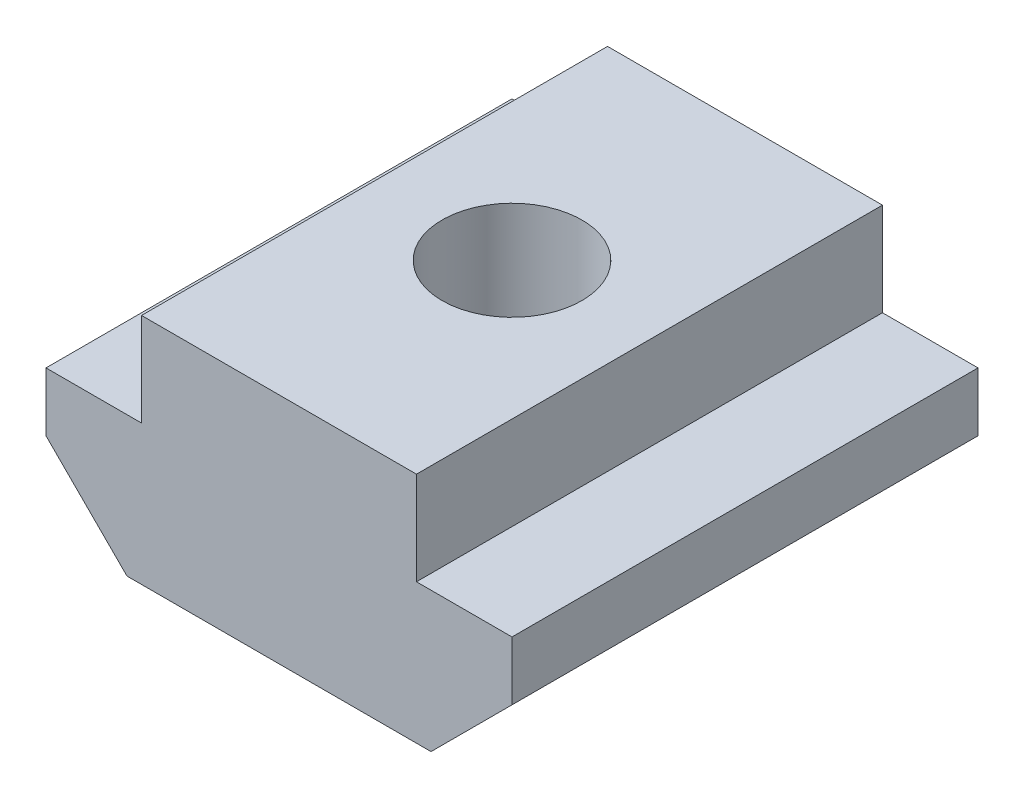
ISO-10303-21;
HEADER;
FILE_DESCRIPTION(('STEP AP214'),'2;1');
FILE_NAME('part.step','',(''),(''),'','','');
FILE_SCHEMA(('AUTOMOTIVE_DESIGN { 1 0 10303 214 1 1 1 1 }'));
ENDSEC;
DATA;
#1=APPLICATION_CONTEXT('core data for automotive mechanical design processes');
#2=APPLICATION_PROTOCOL_DEFINITION('international standard','automotive_design',2000,#1);
#3=PRODUCT_CONTEXT('',#1,'mechanical');
#4=PRODUCT('Part','Part','',(#3));
#5=PRODUCT_RELATED_PRODUCT_CATEGORY('part','',(#4));
#6=PRODUCT_DEFINITION_FORMATION('','',#4);
#7=PRODUCT_DEFINITION_CONTEXT('part definition',#1,'design');
#8=PRODUCT_DEFINITION('design','',#6,#7);
#9=PRODUCT_DEFINITION_SHAPE('','',#8);
#10=(LENGTH_UNIT() NAMED_UNIT(*) SI_UNIT(.MILLI.,.METRE.));
#11=(NAMED_UNIT(*) PLANE_ANGLE_UNIT() SI_UNIT($,.RADIAN.));
#12=(NAMED_UNIT(*) SI_UNIT($,.STERADIAN.) SOLID_ANGLE_UNIT());
#13=UNCERTAINTY_MEASURE_WITH_UNIT(LENGTH_MEASURE(1.E-05),#10,'distance_accuracy_value','');
#14=(GEOMETRIC_REPRESENTATION_CONTEXT(3) GLOBAL_UNCERTAINTY_ASSIGNED_CONTEXT((#13)) GLOBAL_UNIT_ASSIGNED_CONTEXT((#10,
#11,#12)) REPRESENTATION_CONTEXT('',''));
#15=CARTESIAN_POINT('',(0.,0.,0.));
#16=DIRECTION('',(0.,0.,1.));
#17=DIRECTION('',(1.,0.,0.));
#18=AXIS2_PLACEMENT_3D('',#15,#16,#17);
#19=CARTESIAN_POINT('',(-12.2437281150785,-0.348434552617839,10.));
#20=DIRECTION('',(0.707106781186549,0.707106781186546,0.));
#21=DIRECTION('',(-0.707106781186546,0.707106781186549,0.));
#22=AXIS2_PLACEMENT_3D('',#19,#20,#21);
#23=PLANE('',#22);
#24=DIRECTION('',(0.707106781186546,-0.707106781186548,0.));
#25=VECTOR('',#24,1.);
#26=CARTESIAN_POINT('',(-12.2437281150785,-0.348434552617839,0.));
#27=LINE('',#26,#25);
#28=CARTESIAN_POINT('',(-12.2437281150785,-0.348434552617839,0.));
#29=VERTEX_POINT('',#28);
#30=CARTESIAN_POINT('',(-10.5060872587399,-2.08607540895643,0.));
#31=VERTEX_POINT('',#30);
#32=EDGE_CURVE('E147',#29,#31,#27,.T.);
#33=ORIENTED_EDGE('',*,*,#32,.T.);
#34=DIRECTION('',(0.,0.,-1.));
#35=VECTOR('',#34,1.);
#36=CARTESIAN_POINT('',(-10.5060872587399,-2.08607540895643,10.));
#37=LINE('',#36,#35);
#38=CARTESIAN_POINT('',(-10.5060872587399,-2.08607540895643,10.));
#39=VERTEX_POINT('',#38);
#40=EDGE_CURVE('E11',#39,#31,#37,.T.);
#41=ORIENTED_EDGE('',*,*,#40,.F.);
#42=DIRECTION('',(0.707106781186546,-0.707106781186548,0.));
#43=VECTOR('',#42,1.);
#44=CARTESIAN_POINT('',(-12.2437281150785,-0.348434552617839,10.));
#45=LINE('',#44,#43);
#46=CARTESIAN_POINT('',(-12.2437281150785,-0.348434552617839,10.));
#47=VERTEX_POINT('',#46);
#48=EDGE_CURVE('E166',#47,#39,#45,.T.);
#49=ORIENTED_EDGE('',*,*,#48,.F.);
#50=DIRECTION('',(0.,0.,-1.));
#51=VECTOR('',#50,1.);
#52=CARTESIAN_POINT('',(-12.2437281150785,-0.348434552617839,10.));
#53=LINE('',#52,#51);
#54=EDGE_CURVE('E143',#47,#29,#53,.T.);
#55=ORIENTED_EDGE('',*,*,#54,.T.);
#56=EDGE_LOOP('',(#33,#41,#49,#55));
#57=FACE_BOUND('',#56,.T.);
#58=ADVANCED_FACE('F39',(#57),#23,.F.);
#59=CARTESIAN_POINT('',(-10.5060872587399,-2.08607540895643,10.));
#60=DIRECTION('',(0.,1.,0.));
#61=DIRECTION('',(0.,0.,1.));
#62=AXIS2_PLACEMENT_3D('',#59,#60,#61);
#63=PLANE('',#62);
#64=CARTESIAN_POINT('',(-7.2437281150785,-2.08607540895643,5.));
#65=DIRECTION('',(0.,1.,0.));
#66=DIRECTION('',(0.,0.,1.));
#67=AXIS2_PLACEMENT_3D('',#64,#65,#66);
#68=CIRCLE('',#67,1.5);
#69=CARTESIAN_POINT('',(-7.2437281150785,-2.08607540895643,6.5));
#70=VERTEX_POINT('',#69);
#71=EDGE_CURVE('E151',#70,#70,#68,.F.);
#72=ORIENTED_EDGE('',*,*,#71,.F.);
#73=EDGE_LOOP('',(#72));
#74=FACE_BOUND('',#73,.T.);
#75=DIRECTION('',(1.,0.,0.));
#76=VECTOR('',#75,1.);
#77=CARTESIAN_POINT('',(-10.5060872587399,-2.08607540895643,0.));
#78=LINE('',#77,#76);
#79=CARTESIAN_POINT('',(-3.98136897141709,-2.08607540895643,0.));
#80=VERTEX_POINT('',#79);
#81=EDGE_CURVE('E150',#31,#80,#78,.T.);
#82=ORIENTED_EDGE('',*,*,#81,.T.);
#83=DIRECTION('',(0.,0.,-1.));
#84=VECTOR('',#83,1.);
#85=CARTESIAN_POINT('',(-3.98136897141709,-2.08607540895643,10.));
#86=LINE('',#85,#84);
#87=CARTESIAN_POINT('',(-3.98136897141709,-2.08607540895643,10.));
#88=VERTEX_POINT('',#87);
#89=EDGE_CURVE('E47',#88,#80,#86,.T.);
#90=ORIENTED_EDGE('',*,*,#89,.F.);
#91=DIRECTION('',(1.,0.,0.));
#92=VECTOR('',#91,1.);
#93=CARTESIAN_POINT('',(-10.5060872587399,-2.08607540895643,10.));
#94=LINE('',#93,#92);
#95=EDGE_CURVE('E104',#39,#88,#94,.T.);
#96=ORIENTED_EDGE('',*,*,#95,.F.);
#97=ORIENTED_EDGE('',*,*,#40,.T.);
#98=EDGE_LOOP('',(#82,#90,#96,#97));
#99=FACE_BOUND('',#98,.T.);
#100=ADVANCED_FACE('F243',(#74,#99),#63,.F.);
#101=CARTESIAN_POINT('',(-3.98136897141709,-2.08607540895643,10.));
#102=DIRECTION('',(-0.707106781186549,0.707106781186546,0.));
#103=DIRECTION('',(-0.707106781186546,-0.707106781186549,0.));
#104=AXIS2_PLACEMENT_3D('',#101,#102,#103);
#105=PLANE('',#104);
#106=DIRECTION('',(0.707106781186546,0.707106781186548,0.));
#107=VECTOR('',#106,1.);
#108=CARTESIAN_POINT('',(-3.98136897141709,-2.08607540895643,0.));
#109=LINE('',#108,#107);
#110=CARTESIAN_POINT('',(-2.2437281150785,-0.348434552617839,0.));
#111=VERTEX_POINT('',#110);
#112=EDGE_CURVE('E153',#80,#111,#109,.T.);
#113=ORIENTED_EDGE('',*,*,#112,.T.);
#114=DIRECTION('',(0.,0.,-1.));
#115=VECTOR('',#114,1.);
#116=CARTESIAN_POINT('',(-2.2437281150785,-0.348434552617839,10.));
#117=LINE('',#116,#115);
#118=CARTESIAN_POINT('',(-2.2437281150785,-0.348434552617839,10.));
#119=VERTEX_POINT('',#118);
#120=EDGE_CURVE('E179',#119,#111,#117,.T.);
#121=ORIENTED_EDGE('',*,*,#120,.F.);
#122=DIRECTION('',(0.707106781186546,0.707106781186548,0.));
#123=VECTOR('',#122,1.);
#124=CARTESIAN_POINT('',(-3.98136897141709,-2.08607540895643,10.));
#125=LINE('',#124,#123);
#126=EDGE_CURVE('E187',#88,#119,#125,.T.);
#127=ORIENTED_EDGE('',*,*,#126,.F.);
#128=ORIENTED_EDGE('',*,*,#89,.T.);
#129=EDGE_LOOP('',(#113,#121,#127,#128));
#130=FACE_BOUND('',#129,.T.);
#131=ADVANCED_FACE('F185',(#130),#105,.F.);
#132=CARTESIAN_POINT('',(-2.2437281150785,-0.348434552617839,10.));
#133=DIRECTION('',(-1.,0.,0.));
#134=DIRECTION('',(0.,0.,1.));
#135=AXIS2_PLACEMENT_3D('',#132,#133,#134);
#136=PLANE('',#135);
#137=DIRECTION('',(0.,1.,0.));
#138=VECTOR('',#137,1.);
#139=CARTESIAN_POINT('',(-2.2437281150785,-0.348434552617839,0.));
#140=LINE('',#139,#138);
#141=CARTESIAN_POINT('',(-2.2437281150785,0.913924591043569,0.));
#142=VERTEX_POINT('',#141);
#143=EDGE_CURVE('E155',#111,#142,#140,.T.);
#144=ORIENTED_EDGE('',*,*,#143,.T.);
#145=DIRECTION('',(0.,0.,-1.));
#146=VECTOR('',#145,1.);
#147=CARTESIAN_POINT('',(-2.2437281150785,0.913924591043569,10.));
#148=LINE('',#147,#146);
#149=CARTESIAN_POINT('',(-2.2437281150785,0.913924591043569,10.));
#150=VERTEX_POINT('',#149);
#151=EDGE_CURVE('E176',#150,#142,#148,.T.);
#152=ORIENTED_EDGE('',*,*,#151,.F.);
#153=DIRECTION('',(0.,1.,0.));
#154=VECTOR('',#153,1.);
#155=CARTESIAN_POINT('',(-2.2437281150785,-0.348434552617839,10.));
#156=LINE('',#155,#154);
#157=EDGE_CURVE('E205',#119,#150,#156,.T.);
#158=ORIENTED_EDGE('',*,*,#157,.F.);
#159=ORIENTED_EDGE('',*,*,#120,.T.);
#160=EDGE_LOOP('',(#144,#152,#158,#159));
#161=FACE_BOUND('',#160,.T.);
#162=ADVANCED_FACE('F196',(#161),#136,.F.);
#163=CARTESIAN_POINT('',(-2.2437281150785,0.913924591043569,10.));
#164=DIRECTION('',(0.,-1.,0.));
#165=DIRECTION('',(1.,0.,0.));
#166=AXIS2_PLACEMENT_3D('',#163,#164,#165);
#167=PLANE('',#166);
#168=DIRECTION('',(-1.,0.,0.));
#169=VECTOR('',#168,1.);
#170=CARTESIAN_POINT('',(-2.2437281150785,0.913924591043569,0.));
#171=LINE('',#170,#169);
#172=CARTESIAN_POINT('',(-4.2937281150785,0.913924591043569,0.));
#173=VERTEX_POINT('',#172);
#174=EDGE_CURVE('E157',#142,#173,#171,.T.);
#175=ORIENTED_EDGE('',*,*,#174,.T.);
#176=DIRECTION('',(0.,0.,-1.));
#177=VECTOR('',#176,1.);
#178=CARTESIAN_POINT('',(-4.2937281150785,0.913924591043569,10.));
#179=LINE('',#178,#177);
#180=CARTESIAN_POINT('',(-4.2937281150785,0.913924591043569,10.));
#181=VERTEX_POINT('',#180);
#182=EDGE_CURVE('E173',#181,#173,#179,.T.);
#183=ORIENTED_EDGE('',*,*,#182,.F.);
#184=DIRECTION('',(-1.,0.,0.));
#185=VECTOR('',#184,1.);
#186=CARTESIAN_POINT('',(-2.2437281150785,0.913924591043569,10.));
#187=LINE('',#186,#185);
#188=EDGE_CURVE('E202',#150,#181,#187,.T.);
#189=ORIENTED_EDGE('',*,*,#188,.F.);
#190=ORIENTED_EDGE('',*,*,#151,.T.);
#191=EDGE_LOOP('',(#175,#183,#189,#190));
#192=FACE_BOUND('',#191,.T.);
#193=ADVANCED_FACE('F200',(#192),#167,.F.);
#194=CARTESIAN_POINT('',(-4.2937281150785,0.913924591043569,10.));
#195=DIRECTION('',(-1.,0.,0.));
#196=DIRECTION('',(0.,0.,1.));
#197=AXIS2_PLACEMENT_3D('',#194,#195,#196);
#198=PLANE('',#197);
#199=DIRECTION('',(0.,1.,0.));
#200=VECTOR('',#199,1.);
#201=CARTESIAN_POINT('',(-4.2937281150785,0.913924591043569,0.));
#202=LINE('',#201,#200);
#203=CARTESIAN_POINT('',(-4.2937281150785,2.91392459104357,0.));
#204=VERTEX_POINT('',#203);
#205=EDGE_CURVE('E159',#173,#204,#202,.T.);
#206=ORIENTED_EDGE('',*,*,#205,.T.);
#207=DIRECTION('',(0.,0.,-1.));
#208=VECTOR('',#207,1.);
#209=CARTESIAN_POINT('',(-4.2937281150785,2.91392459104357,10.));
#210=LINE('',#209,#208);
#211=CARTESIAN_POINT('',(-4.2937281150785,2.91392459104357,10.));
#212=VERTEX_POINT('',#211);
#213=EDGE_CURVE('E170',#212,#204,#210,.T.);
#214=ORIENTED_EDGE('',*,*,#213,.F.);
#215=DIRECTION('',(0.,1.,0.));
#216=VECTOR('',#215,1.);
#217=CARTESIAN_POINT('',(-4.2937281150785,0.913924591043569,10.));
#218=LINE('',#217,#216);
#219=EDGE_CURVE('E204',#181,#212,#218,.T.);
#220=ORIENTED_EDGE('',*,*,#219,.F.);
#221=ORIENTED_EDGE('',*,*,#182,.T.);
#222=EDGE_LOOP('',(#206,#214,#220,#221));
#223=FACE_BOUND('',#222,.T.);
#224=ADVANCED_FACE('F225',(#223),#198,.F.);
#225=CARTESIAN_POINT('',(-4.2937281150785,2.91392459104357,10.));
#226=DIRECTION('',(0.,-1.,0.));
#227=DIRECTION('',(0.,0.,-1.));
#228=AXIS2_PLACEMENT_3D('',#225,#226,#227);
#229=PLANE('',#228);
#230=CARTESIAN_POINT('',(-7.2437281150785,2.91392459104357,5.));
#231=DIRECTION('',(0.,1.,0.));
#232=DIRECTION('',(0.,0.,1.));
#233=AXIS2_PLACEMENT_3D('',#230,#231,#232);
#234=CIRCLE('',#233,1.5);
#235=CARTESIAN_POINT('',(-7.2437281150785,2.91392459104357,6.5));
#236=VERTEX_POINT('',#235);
#237=EDGE_CURVE('E215',#236,#236,#234,.T.);
#238=ORIENTED_EDGE('',*,*,#237,.F.);
#239=EDGE_LOOP('',(#238));
#240=FACE_BOUND('',#239,.T.);
#241=DIRECTION('',(-1.,0.,0.));
#242=VECTOR('',#241,1.);
#243=CARTESIAN_POINT('',(-4.2937281150785,2.91392459104357,0.));
#244=LINE('',#243,#242);
#245=CARTESIAN_POINT('',(-10.1937281150785,2.91392459104357,0.));
#246=VERTEX_POINT('',#245);
#247=EDGE_CURVE('E161',#204,#246,#244,.T.);
#248=ORIENTED_EDGE('',*,*,#247,.T.);
#249=DIRECTION('',(0.,0.,-1.));
#250=VECTOR('',#249,1.);
#251=CARTESIAN_POINT('',(-10.1937281150785,2.91392459104357,10.));
#252=LINE('',#251,#250);
#253=CARTESIAN_POINT('',(-10.1937281150785,2.91392459104357,10.));
#254=VERTEX_POINT('',#253);
#255=EDGE_CURVE('E138',#254,#246,#252,.T.);
#256=ORIENTED_EDGE('',*,*,#255,.F.);
#257=DIRECTION('',(-1.,0.,0.));
#258=VECTOR('',#257,1.);
#259=CARTESIAN_POINT('',(-4.2937281150785,2.91392459104357,10.));
#260=LINE('',#259,#258);
#261=EDGE_CURVE('E129',#212,#254,#260,.T.);
#262=ORIENTED_EDGE('',*,*,#261,.F.);
#263=ORIENTED_EDGE('',*,*,#213,.T.);
#264=EDGE_LOOP('',(#248,#256,#262,#263));
#265=FACE_BOUND('',#264,.T.);
#266=ADVANCED_FACE('F222',(#240,#265),#229,.F.);
#267=CARTESIAN_POINT('',(-10.1937281150785,2.91392459104357,10.));
#268=DIRECTION('',(1.,0.,0.));
#269=DIRECTION('',(0.,0.,-1.));
#270=AXIS2_PLACEMENT_3D('',#267,#268,#269);
#271=PLANE('',#270);
#272=DIRECTION('',(0.,-1.,0.));
#273=VECTOR('',#272,1.);
#274=CARTESIAN_POINT('',(-10.1937281150785,2.91392459104357,0.));
#275=LINE('',#274,#273);
#276=CARTESIAN_POINT('',(-10.1937281150785,0.913924591043569,0.));
#277=VERTEX_POINT('',#276);
#278=EDGE_CURVE('E137',#246,#277,#275,.T.);
#279=ORIENTED_EDGE('',*,*,#278,.T.);
#280=DIRECTION('',(0.,0.,-1.));
#281=VECTOR('',#280,1.);
#282=CARTESIAN_POINT('',(-10.1937281150785,0.913924591043569,10.));
#283=LINE('',#282,#281);
#284=CARTESIAN_POINT('',(-10.1937281150785,0.913924591043569,10.));
#285=VERTEX_POINT('',#284);
#286=EDGE_CURVE('E134',#285,#277,#283,.T.);
#287=ORIENTED_EDGE('',*,*,#286,.F.);
#288=DIRECTION('',(0.,-1.,0.));
#289=VECTOR('',#288,1.);
#290=CARTESIAN_POINT('',(-10.1937281150785,2.91392459104357,10.));
#291=LINE('',#290,#289);
#292=EDGE_CURVE('E123',#254,#285,#291,.T.);
#293=ORIENTED_EDGE('',*,*,#292,.F.);
#294=ORIENTED_EDGE('',*,*,#255,.T.);
#295=EDGE_LOOP('',(#279,#287,#293,#294));
#296=FACE_BOUND('',#295,.T.);
#297=ADVANCED_FACE('F135',(#296),#271,.F.);
#298=CARTESIAN_POINT('',(-10.1937281150785,0.913924591043569,10.));
#299=DIRECTION('',(0.,-1.,0.));
#300=DIRECTION('',(1.,0.,0.));
#301=AXIS2_PLACEMENT_3D('',#298,#299,#300);
#302=PLANE('',#301);
#303=DIRECTION('',(-1.,0.,0.));
#304=VECTOR('',#303,1.);
#305=CARTESIAN_POINT('',(-10.1937281150785,0.913924591043569,0.));
#306=LINE('',#305,#304);
#307=CARTESIAN_POINT('',(-12.2437281150785,0.913924591043569,0.));
#308=VERTEX_POINT('',#307);
#309=EDGE_CURVE('E90',#277,#308,#306,.T.);
#310=ORIENTED_EDGE('',*,*,#309,.T.);
#311=DIRECTION('',(0.,0.,-1.));
#312=VECTOR('',#311,1.);
#313=CARTESIAN_POINT('',(-12.2437281150785,0.913924591043569,10.));
#314=LINE('',#313,#312);
#315=CARTESIAN_POINT('',(-12.2437281150785,0.913924591043569,10.));
#316=VERTEX_POINT('',#315);
#317=EDGE_CURVE('E139',#316,#308,#314,.T.);
#318=ORIENTED_EDGE('',*,*,#317,.F.);
#319=DIRECTION('',(-1.,0.,0.));
#320=VECTOR('',#319,1.);
#321=CARTESIAN_POINT('',(-10.1937281150785,0.913924591043569,10.));
#322=LINE('',#321,#320);
#323=EDGE_CURVE('E127',#285,#316,#322,.T.);
#324=ORIENTED_EDGE('',*,*,#323,.F.);
#325=ORIENTED_EDGE('',*,*,#286,.T.);
#326=EDGE_LOOP('',(#310,#318,#324,#325));
#327=FACE_BOUND('',#326,.T.);
#328=ADVANCED_FACE('F141',(#327),#302,.F.);
#329=CARTESIAN_POINT('',(-12.2437281150785,0.913924591043569,10.));
#330=DIRECTION('',(1.,0.,0.));
#331=DIRECTION('',(0.,0.,-1.));
#332=AXIS2_PLACEMENT_3D('',#329,#330,#331);
#333=PLANE('',#332);
#334=DIRECTION('',(0.,-1.,0.));
#335=VECTOR('',#334,1.);
#336=CARTESIAN_POINT('',(-12.2437281150785,0.913924591043569,0.));
#337=LINE('',#336,#335);
#338=EDGE_CURVE('E96',#308,#29,#337,.T.);
#339=ORIENTED_EDGE('',*,*,#338,.T.);
#340=ORIENTED_EDGE('',*,*,#54,.F.);
#341=DIRECTION('',(0.,-1.,0.));
#342=VECTOR('',#341,1.);
#343=CARTESIAN_POINT('',(-12.2437281150785,0.913924591043569,10.));
#344=LINE('',#343,#342);
#345=EDGE_CURVE('E55',#316,#47,#344,.T.);
#346=ORIENTED_EDGE('',*,*,#345,.F.);
#347=ORIENTED_EDGE('',*,*,#317,.T.);
#348=EDGE_LOOP('',(#339,#340,#346,#347));
#349=FACE_BOUND('',#348,.T.);
#350=ADVANCED_FACE('F232',(#349),#333,.F.);
#351=CARTESIAN_POINT('',(0.,0.,10.));
#352=DIRECTION('',(0.,0.,1.));
#353=DIRECTION('',(1.,0.,0.));
#354=AXIS2_PLACEMENT_3D('',#351,#352,#353);
#355=PLANE('',#354);
#356=ORIENTED_EDGE('',*,*,#48,.T.);
#357=ORIENTED_EDGE('',*,*,#95,.T.);
#358=ORIENTED_EDGE('',*,*,#126,.T.);
#359=ORIENTED_EDGE('',*,*,#157,.T.);
#360=ORIENTED_EDGE('',*,*,#188,.T.);
#361=ORIENTED_EDGE('',*,*,#219,.T.);
#362=ORIENTED_EDGE('',*,*,#261,.T.);
#363=ORIENTED_EDGE('',*,*,#292,.T.);
#364=ORIENTED_EDGE('',*,*,#323,.T.);
#365=ORIENTED_EDGE('',*,*,#345,.T.);
#366=EDGE_LOOP('',(#356,#357,#358,#359,#360,#361,#362,#363,#364,#365));
#367=FACE_BOUND('',#366,.T.);
#368=ADVANCED_FACE('F125',(#367),#355,.T.);
#369=CARTESIAN_POINT('',(0.,0.,0.));
#370=DIRECTION('',(0.,0.,1.));
#371=DIRECTION('',(1.,0.,0.));
#372=AXIS2_PLACEMENT_3D('',#369,#370,#371);
#373=PLANE('',#372);
#374=ORIENTED_EDGE('',*,*,#32,.F.);
#375=ORIENTED_EDGE('',*,*,#338,.F.);
#376=ORIENTED_EDGE('',*,*,#309,.F.);
#377=ORIENTED_EDGE('',*,*,#278,.F.);
#378=ORIENTED_EDGE('',*,*,#247,.F.);
#379=ORIENTED_EDGE('',*,*,#205,.F.);
#380=ORIENTED_EDGE('',*,*,#174,.F.);
#381=ORIENTED_EDGE('',*,*,#143,.F.);
#382=ORIENTED_EDGE('',*,*,#112,.F.);
#383=ORIENTED_EDGE('',*,*,#81,.F.);
#384=EDGE_LOOP('',(#374,#375,#376,#377,#378,#379,#380,#381,#382,#383));
#385=FACE_BOUND('',#384,.T.);
#386=ADVANCED_FACE('F191',(#385),#373,.F.);
#387=CARTESIAN_POINT('',(-7.2437281150785,-2.08707540895643,5.));
#388=DIRECTION('',(0.,1.,0.));
#389=DIRECTION('',(0.,0.,1.));
#390=AXIS2_PLACEMENT_3D('',#387,#388,#389);
#391=CYLINDRICAL_SURFACE('',#390,1.5);
#392=ORIENTED_EDGE('',*,*,#237,.T.);
#393=EDGE_LOOP('',(#392));
#394=FACE_BOUND('',#393,.T.);
#395=ORIENTED_EDGE('',*,*,#71,.T.);
#396=EDGE_LOOP('',(#395));
#397=FACE_BOUND('',#396,.T.);
#398=ADVANCED_FACE('F219',(#394,#397),#391,.F.);
#399=CLOSED_SHELL('',(#58,#100,#131,#162,#193,#224,#266,#297,#328,#350,#368,#386,#398));
#400=MANIFOLD_SOLID_BREP('B2',#399);
#401=ADVANCED_BREP_SHAPE_REPRESENTATION('',(#18,#400),#14);
#402=SHAPE_DEFINITION_REPRESENTATION(#9,#401);
ENDSEC;
END-ISO-10303-21;
